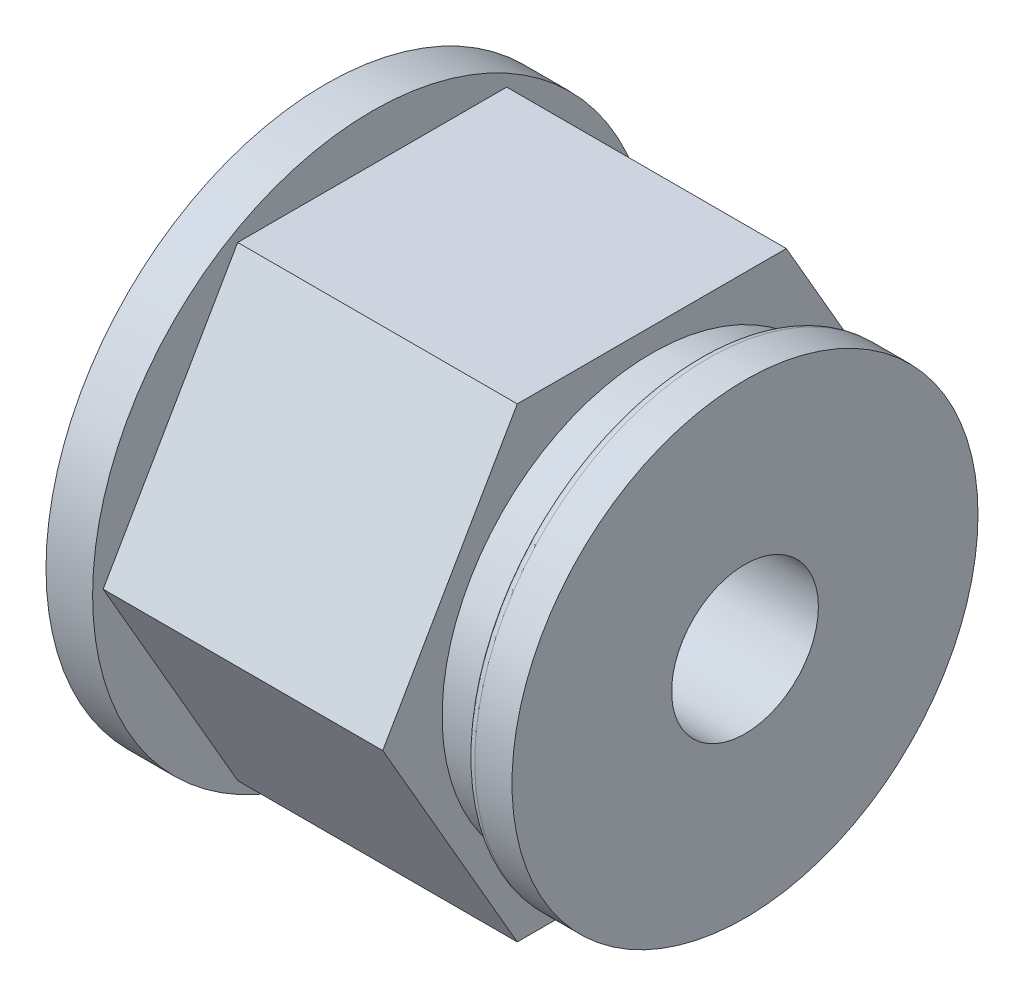
ISO-10303-21;
HEADER;
FILE_DESCRIPTION(('STEP AP214'),'2;1');
FILE_NAME('part.step','',(''),(''),'','','');
FILE_SCHEMA(('AUTOMOTIVE_DESIGN { 1 0 10303 214 1 1 1 1 }'));
ENDSEC;
DATA;
#1=APPLICATION_CONTEXT('core data for automotive mechanical design processes');
#2=APPLICATION_PROTOCOL_DEFINITION('international standard','automotive_design',2000,#1);
#3=PRODUCT_CONTEXT('',#1,'mechanical');
#4=PRODUCT('Part','Part','',(#3));
#5=PRODUCT_RELATED_PRODUCT_CATEGORY('part','',(#4));
#6=PRODUCT_DEFINITION_FORMATION('','',#4);
#7=PRODUCT_DEFINITION_CONTEXT('part definition',#1,'design');
#8=PRODUCT_DEFINITION('design','',#6,#7);
#9=PRODUCT_DEFINITION_SHAPE('','',#8);
#10=(LENGTH_UNIT() NAMED_UNIT(*) SI_UNIT(.MILLI.,.METRE.));
#11=(NAMED_UNIT(*) PLANE_ANGLE_UNIT() SI_UNIT($,.RADIAN.));
#12=(NAMED_UNIT(*) SI_UNIT($,.STERADIAN.) SOLID_ANGLE_UNIT());
#13=UNCERTAINTY_MEASURE_WITH_UNIT(LENGTH_MEASURE(1.E-05),#10,'distance_accuracy_value','');
#14=(GEOMETRIC_REPRESENTATION_CONTEXT(3) GLOBAL_UNCERTAINTY_ASSIGNED_CONTEXT((#13)) GLOBAL_UNIT_ASSIGNED_CONTEXT((#10,
#11,#12)) REPRESENTATION_CONTEXT('',''));
#15=CARTESIAN_POINT('',(0.,0.,0.));
#16=DIRECTION('',(0.,0.,1.));
#17=DIRECTION('',(1.,0.,0.));
#18=AXIS2_PLACEMENT_3D('',#15,#16,#17);
#19=CARTESIAN_POINT('',(-1.27,0.,0.));
#20=DIRECTION('',(1.,0.,0.));
#21=DIRECTION('',(0.,0.,-1.));
#22=AXIS2_PLACEMENT_3D('',#19,#20,#21);
#23=CYLINDRICAL_SURFACE('',#22,7.62);
#24=CARTESIAN_POINT('',(-1.27,0.,0.));
#25=DIRECTION('',(1.,0.,0.));
#26=DIRECTION('',(0.,0.,-1.));
#27=AXIS2_PLACEMENT_3D('',#24,#25,#26);
#28=CIRCLE('',#27,7.62);
#29=CARTESIAN_POINT('',(-1.27,0.,-7.62));
#30=VERTEX_POINT('',#29);
#31=EDGE_CURVE('E111',#30,#30,#28,.T.);
#32=ORIENTED_EDGE('',*,*,#31,.T.);
#33=EDGE_LOOP('',(#32));
#34=FACE_BOUND('',#33,.T.);
#35=CARTESIAN_POINT('',(0.,0.,0.));
#36=DIRECTION('',(1.,0.,0.));
#37=DIRECTION('',(0.,0.,-1.));
#38=AXIS2_PLACEMENT_3D('',#35,#36,#37);
#39=CIRCLE('',#38,7.62);
#40=CARTESIAN_POINT('',(0.,0.,-7.62));
#41=VERTEX_POINT('',#40);
#42=EDGE_CURVE('E108',#41,#41,#39,.T.);
#43=ORIENTED_EDGE('',*,*,#42,.F.);
#44=EDGE_LOOP('',(#43));
#45=FACE_BOUND('',#44,.T.);
#46=ADVANCED_FACE('F35',(#34,#45),#23,.T.);
#47=CARTESIAN_POINT('',(-1.27,0.,0.));
#48=DIRECTION('',(1.,0.,0.));
#49=DIRECTION('',(0.,0.,-1.));
#50=AXIS2_PLACEMENT_3D('',#47,#48,#49);
#51=PLANE('',#50);
#52=CARTESIAN_POINT('',(-1.27,0.,0.));
#53=DIRECTION('',(1.,0.,0.));
#54=DIRECTION('',(0.,0.,-1.));
#55=AXIS2_PLACEMENT_3D('',#52,#53,#54);
#56=CIRCLE('',#55,2.);
#57=CARTESIAN_POINT('',(-1.27,0.,-2.));
#58=VERTEX_POINT('',#57);
#59=EDGE_CURVE('E156',#58,#58,#56,.F.);
#60=ORIENTED_EDGE('',*,*,#59,.F.);
#61=EDGE_LOOP('',(#60));
#62=FACE_BOUND('',#61,.T.);
#63=ORIENTED_EDGE('',*,*,#31,.F.);
#64=EDGE_LOOP('',(#63));
#65=FACE_BOUND('',#64,.T.);
#66=ADVANCED_FACE('F216',(#62,#65),#51,.F.);
#67=CARTESIAN_POINT('',(0.,0.,0.));
#68=DIRECTION('',(1.,0.,0.));
#69=DIRECTION('',(0.,0.,-1.));
#70=AXIS2_PLACEMENT_3D('',#67,#68,#69);
#71=PLANE('',#70);
#72=DIRECTION('',(0.,0.,1.));
#73=VECTOR('',#72,1.);
#74=CARTESIAN_POINT('',(0.,6.35,-3.66617420935412));
#75=LINE('',#74,#73);
#76=CARTESIAN_POINT('',(0.,6.35,-3.66617420935412));
#77=VERTEX_POINT('',#76);
#78=CARTESIAN_POINT('',(0.,6.35,3.66617420935412));
#79=VERTEX_POINT('',#78);
#80=EDGE_CURVE('E50',#77,#79,#75,.T.);
#81=ORIENTED_EDGE('',*,*,#80,.F.);
#82=DIRECTION('',(0.,0.866025403784439,0.5));
#83=VECTOR('',#82,1.);
#84=CARTESIAN_POINT('',(0.,0.,-7.33234841870825));
#85=LINE('',#84,#83);
#86=CARTESIAN_POINT('',(0.,0.,-7.33234841870825));
#87=VERTEX_POINT('',#86);
#88=EDGE_CURVE('E54',#87,#77,#85,.T.);
#89=ORIENTED_EDGE('',*,*,#88,.F.);
#90=DIRECTION('',(0.,0.866025403784438,-0.5));
#91=VECTOR('',#90,1.);
#92=CARTESIAN_POINT('',(0.,-6.35,-3.66617420935412));
#93=LINE('',#92,#91);
#94=CARTESIAN_POINT('',(0.,-6.35,-3.66617420935412));
#95=VERTEX_POINT('',#94);
#96=EDGE_CURVE('E181',#95,#87,#93,.T.);
#97=ORIENTED_EDGE('',*,*,#96,.F.);
#98=DIRECTION('',(0.,0.,-1.));
#99=VECTOR('',#98,1.);
#100=CARTESIAN_POINT('',(0.,-6.35,3.66617420935412));
#101=LINE('',#100,#99);
#102=CARTESIAN_POINT('',(0.,-6.35,3.66617420935412));
#103=VERTEX_POINT('',#102);
#104=EDGE_CURVE('E178',#103,#95,#101,.T.);
#105=ORIENTED_EDGE('',*,*,#104,.F.);
#106=DIRECTION('',(0.,-0.866025403784439,-0.5));
#107=VECTOR('',#106,1.);
#108=CARTESIAN_POINT('',(0.,0.,7.33234841870825));
#109=LINE('',#108,#107);
#110=CARTESIAN_POINT('',(0.,0.,7.33234841870825));
#111=VERTEX_POINT('',#110);
#112=EDGE_CURVE('E175',#111,#103,#109,.T.);
#113=ORIENTED_EDGE('',*,*,#112,.F.);
#114=DIRECTION('',(0.,-0.866025403784438,0.5));
#115=VECTOR('',#114,1.);
#116=CARTESIAN_POINT('',(0.,6.35,3.66617420935412));
#117=LINE('',#116,#115);
#118=EDGE_CURVE('E158',#79,#111,#117,.T.);
#119=ORIENTED_EDGE('',*,*,#118,.F.);
#120=EDGE_LOOP('',(#81,#89,#97,#105,#113,#119));
#121=FACE_BOUND('',#120,.T.);
#122=ORIENTED_EDGE('',*,*,#42,.T.);
#123=EDGE_LOOP('',(#122));
#124=FACE_BOUND('',#123,.T.);
#125=ADVANCED_FACE('F198',(#121,#124),#71,.T.);
#126=CARTESIAN_POINT('',(7.62,6.35,-3.66617420935412));
#127=DIRECTION('',(0.,-1.,0.));
#128=DIRECTION('',(0.,0.,-1.));
#129=AXIS2_PLACEMENT_3D('',#126,#127,#128);
#130=PLANE('',#129);
#131=ORIENTED_EDGE('',*,*,#80,.T.);
#132=DIRECTION('',(-1.,0.,0.));
#133=VECTOR('',#132,1.);
#134=CARTESIAN_POINT('',(7.62,6.35,3.66617420935412));
#135=LINE('',#134,#133);
#136=CARTESIAN_POINT('',(7.62,6.35,3.66617420935412));
#137=VERTEX_POINT('',#136);
#138=EDGE_CURVE('E91',#137,#79,#135,.T.);
#139=ORIENTED_EDGE('',*,*,#138,.F.);
#140=DIRECTION('',(0.,0.,1.));
#141=VECTOR('',#140,1.);
#142=CARTESIAN_POINT('',(7.62,6.35,-3.66617420935412));
#143=LINE('',#142,#141);
#144=CARTESIAN_POINT('',(7.62,6.35,-3.66617420935412));
#145=VERTEX_POINT('',#144);
#146=EDGE_CURVE('E97',#145,#137,#143,.T.);
#147=ORIENTED_EDGE('',*,*,#146,.F.);
#148=DIRECTION('',(-1.,0.,0.));
#149=VECTOR('',#148,1.);
#150=CARTESIAN_POINT('',(7.62,6.35,-3.66617420935412));
#151=LINE('',#150,#149);
#152=EDGE_CURVE('E172',#145,#77,#151,.T.);
#153=ORIENTED_EDGE('',*,*,#152,.T.);
#154=EDGE_LOOP('',(#131,#139,#147,#153));
#155=FACE_BOUND('',#154,.T.);
#156=ADVANCED_FACE('F107',(#155),#130,.F.);
#157=CARTESIAN_POINT('',(7.62,6.35,3.66617420935412));
#158=DIRECTION('',(0.,-0.5,-0.866025403784439));
#159=DIRECTION('',(0.,0.866025403784439,-0.5));
#160=AXIS2_PLACEMENT_3D('',#157,#158,#159);
#161=PLANE('',#160);
#162=ORIENTED_EDGE('',*,*,#118,.T.);
#163=DIRECTION('',(-1.,0.,0.));
#164=VECTOR('',#163,1.);
#165=CARTESIAN_POINT('',(7.62,0.,7.33234841870825));
#166=LINE('',#165,#164);
#167=CARTESIAN_POINT('',(7.62,0.,7.33234841870825));
#168=VERTEX_POINT('',#167);
#169=EDGE_CURVE('E93',#168,#111,#166,.T.);
#170=ORIENTED_EDGE('',*,*,#169,.F.);
#171=DIRECTION('',(0.,-0.866025403784438,0.5));
#172=VECTOR('',#171,1.);
#173=CARTESIAN_POINT('',(7.62,6.35,3.66617420935412));
#174=LINE('',#173,#172);
#175=EDGE_CURVE('E86',#137,#168,#174,.T.);
#176=ORIENTED_EDGE('',*,*,#175,.F.);
#177=ORIENTED_EDGE('',*,*,#138,.T.);
#178=EDGE_LOOP('',(#162,#170,#176,#177));
#179=FACE_BOUND('',#178,.T.);
#180=ADVANCED_FACE('F89',(#179),#161,.F.);
#181=CARTESIAN_POINT('',(7.62,0.,7.33234841870825));
#182=DIRECTION('',(0.,0.5,-0.866025403784439));
#183=DIRECTION('',(0.,0.866025403784439,0.5));
#184=AXIS2_PLACEMENT_3D('',#181,#182,#183);
#185=PLANE('',#184);
#186=ORIENTED_EDGE('',*,*,#112,.T.);
#187=DIRECTION('',(-1.,0.,0.));
#188=VECTOR('',#187,1.);
#189=CARTESIAN_POINT('',(7.62,-6.35,3.66617420935412));
#190=LINE('',#189,#188);
#191=CARTESIAN_POINT('',(7.62,-6.35,3.66617420935412));
#192=VERTEX_POINT('',#191);
#193=EDGE_CURVE('E113',#192,#103,#190,.T.);
#194=ORIENTED_EDGE('',*,*,#193,.F.);
#195=DIRECTION('',(0.,-0.866025403784439,-0.5));
#196=VECTOR('',#195,1.);
#197=CARTESIAN_POINT('',(7.62,0.,7.33234841870825));
#198=LINE('',#197,#196);
#199=EDGE_CURVE('E96',#168,#192,#198,.T.);
#200=ORIENTED_EDGE('',*,*,#199,.F.);
#201=ORIENTED_EDGE('',*,*,#169,.T.);
#202=EDGE_LOOP('',(#186,#194,#200,#201));
#203=FACE_BOUND('',#202,.T.);
#204=ADVANCED_FACE('F197',(#203),#185,.F.);
#205=CARTESIAN_POINT('',(7.62,-6.35,3.66617420935412));
#206=DIRECTION('',(0.,1.,0.));
#207=DIRECTION('',(0.,0.,1.));
#208=AXIS2_PLACEMENT_3D('',#205,#206,#207);
#209=PLANE('',#208);
#210=ORIENTED_EDGE('',*,*,#104,.T.);
#211=DIRECTION('',(-1.,0.,0.));
#212=VECTOR('',#211,1.);
#213=CARTESIAN_POINT('',(7.62,-6.35,-3.66617420935412));
#214=LINE('',#213,#212);
#215=CARTESIAN_POINT('',(7.62,-6.35,-3.66617420935412));
#216=VERTEX_POINT('',#215);
#217=EDGE_CURVE('E188',#216,#95,#214,.T.);
#218=ORIENTED_EDGE('',*,*,#217,.F.);
#219=DIRECTION('',(0.,0.,-1.));
#220=VECTOR('',#219,1.);
#221=CARTESIAN_POINT('',(7.62,-6.35,3.66617420935412));
#222=LINE('',#221,#220);
#223=EDGE_CURVE('E168',#192,#216,#222,.T.);
#224=ORIENTED_EDGE('',*,*,#223,.F.);
#225=ORIENTED_EDGE('',*,*,#193,.T.);
#226=EDGE_LOOP('',(#210,#218,#224,#225));
#227=FACE_BOUND('',#226,.T.);
#228=ADVANCED_FACE('F194',(#227),#209,.F.);
#229=CARTESIAN_POINT('',(7.62,-6.35,-3.66617420935412));
#230=DIRECTION('',(0.,0.5,0.866025403784438));
#231=DIRECTION('',(0.,-0.866025403784438,0.5));
#232=AXIS2_PLACEMENT_3D('',#229,#230,#231);
#233=PLANE('',#232);
#234=ORIENTED_EDGE('',*,*,#96,.T.);
#235=DIRECTION('',(-1.,0.,0.));
#236=VECTOR('',#235,1.);
#237=CARTESIAN_POINT('',(7.62,0.,-7.33234841870825));
#238=LINE('',#237,#236);
#239=CARTESIAN_POINT('',(7.62,0.,-7.33234841870825));
#240=VERTEX_POINT('',#239);
#241=EDGE_CURVE('E185',#240,#87,#238,.T.);
#242=ORIENTED_EDGE('',*,*,#241,.F.);
#243=DIRECTION('',(0.,0.866025403784438,-0.5));
#244=VECTOR('',#243,1.);
#245=CARTESIAN_POINT('',(7.62,-6.35,-3.66617420935412));
#246=LINE('',#245,#244);
#247=EDGE_CURVE('E170',#216,#240,#246,.T.);
#248=ORIENTED_EDGE('',*,*,#247,.F.);
#249=ORIENTED_EDGE('',*,*,#217,.T.);
#250=EDGE_LOOP('',(#234,#242,#248,#249));
#251=FACE_BOUND('',#250,.T.);
#252=ADVANCED_FACE('F202',(#251),#233,.F.);
#253=CARTESIAN_POINT('',(7.62,0.,-7.33234841870825));
#254=DIRECTION('',(0.,-0.5,0.866025403784439));
#255=DIRECTION('',(0.,-0.866025403784439,-0.5));
#256=AXIS2_PLACEMENT_3D('',#253,#254,#255);
#257=PLANE('',#256);
#258=ORIENTED_EDGE('',*,*,#88,.T.);
#259=ORIENTED_EDGE('',*,*,#152,.F.);
#260=DIRECTION('',(0.,0.866025403784439,0.5));
#261=VECTOR('',#260,1.);
#262=CARTESIAN_POINT('',(7.62,0.,-7.33234841870825));
#263=LINE('',#262,#261);
#264=EDGE_CURVE('E102',#240,#145,#263,.T.);
#265=ORIENTED_EDGE('',*,*,#264,.F.);
#266=ORIENTED_EDGE('',*,*,#241,.T.);
#267=EDGE_LOOP('',(#258,#259,#265,#266));
#268=FACE_BOUND('',#267,.T.);
#269=ADVANCED_FACE('F205',(#268),#257,.F.);
#270=CARTESIAN_POINT('',(7.62,0.,0.));
#271=DIRECTION('',(1.,0.,0.));
#272=DIRECTION('',(0.,0.,-1.));
#273=AXIS2_PLACEMENT_3D('',#270,#271,#272);
#274=PLANE('',#273);
#275=CARTESIAN_POINT('',(7.62,0.,0.));
#276=DIRECTION('',(1.,0.,0.));
#277=DIRECTION('',(0.,0.,-1.));
#278=AXIS2_PLACEMENT_3D('',#275,#276,#277);
#279=CIRCLE('',#278,5.715);
#280=CARTESIAN_POINT('',(7.62,0.,-5.715));
#281=VERTEX_POINT('',#280);
#282=EDGE_CURVE('E118',#281,#281,#279,.T.);
#283=ORIENTED_EDGE('',*,*,#282,.F.);
#284=EDGE_LOOP('',(#283));
#285=FACE_BOUND('',#284,.T.);
#286=ORIENTED_EDGE('',*,*,#146,.T.);
#287=ORIENTED_EDGE('',*,*,#175,.T.);
#288=ORIENTED_EDGE('',*,*,#199,.T.);
#289=ORIENTED_EDGE('',*,*,#223,.T.);
#290=ORIENTED_EDGE('',*,*,#247,.T.);
#291=ORIENTED_EDGE('',*,*,#264,.T.);
#292=EDGE_LOOP('',(#286,#287,#288,#289,#290,#291));
#293=FACE_BOUND('',#292,.T.);
#294=ADVANCED_FACE('F100',(#285,#293),#274,.T.);
#295=CARTESIAN_POINT('',(8.89,0.,0.));
#296=DIRECTION('',(-1.,0.,0.));
#297=DIRECTION('',(0.,0.,1.));
#298=AXIS2_PLACEMENT_3D('',#295,#296,#297);
#299=CYLINDRICAL_SURFACE('',#298,5.715);
#300=CARTESIAN_POINT('',(8.636,0.,0.));
#301=DIRECTION('',(1.,0.,0.));
#302=DIRECTION('',(0.,0.,-1.));
#303=AXIS2_PLACEMENT_3D('',#300,#301,#302);
#304=CIRCLE('',#303,5.715);
#305=CARTESIAN_POINT('',(8.636,0.,-5.715));
#306=VERTEX_POINT('',#305);
#307=EDGE_CURVE('E43',#306,#306,#304,.F.);
#308=ORIENTED_EDGE('',*,*,#307,.T.);
#309=EDGE_LOOP('',(#308));
#310=FACE_BOUND('',#309,.T.);
#311=ORIENTED_EDGE('',*,*,#282,.T.);
#312=EDGE_LOOP('',(#311));
#313=FACE_BOUND('',#312,.T.);
#314=ADVANCED_FACE('F128',(#310,#313),#299,.T.);
#315=CARTESIAN_POINT('',(10.16,0.,0.));
#316=DIRECTION('',(-1.,0.,0.));
#317=DIRECTION('',(0.,0.,1.));
#318=AXIS2_PLACEMENT_3D('',#315,#316,#317);
#319=CYLINDRICAL_SURFACE('',#318,6.35);
#320=CARTESIAN_POINT('',(9.144,0.,0.));
#321=DIRECTION('',(1.,0.,0.));
#322=DIRECTION('',(0.,0.,-1.));
#323=AXIS2_PLACEMENT_3D('',#320,#321,#322);
#324=CIRCLE('',#323,6.35);
#325=CARTESIAN_POINT('',(9.144,0.,-6.35));
#326=VERTEX_POINT('',#325);
#327=EDGE_CURVE('E11',#326,#326,#324,.T.);
#328=ORIENTED_EDGE('',*,*,#327,.T.);
#329=EDGE_LOOP('',(#328));
#330=FACE_BOUND('',#329,.T.);
#331=CARTESIAN_POINT('',(10.16,0.,0.));
#332=DIRECTION('',(1.,0.,0.));
#333=DIRECTION('',(0.,0.,-1.));
#334=AXIS2_PLACEMENT_3D('',#331,#332,#333);
#335=CIRCLE('',#334,6.35);
#336=CARTESIAN_POINT('',(10.16,0.,-6.35));
#337=VERTEX_POINT('',#336);
#338=EDGE_CURVE('E154',#337,#337,#335,.T.);
#339=ORIENTED_EDGE('',*,*,#338,.F.);
#340=EDGE_LOOP('',(#339));
#341=FACE_BOUND('',#340,.T.);
#342=ADVANCED_FACE('F148',(#330,#341),#319,.T.);
#343=CARTESIAN_POINT('',(10.16,0.,0.));
#344=DIRECTION('',(1.,0.,0.));
#345=DIRECTION('',(0.,0.,-1.));
#346=AXIS2_PLACEMENT_3D('',#343,#344,#345);
#347=PLANE('',#346);
#348=CARTESIAN_POINT('',(10.16,0.,0.));
#349=DIRECTION('',(1.,0.,0.));
#350=DIRECTION('',(0.,0.,-1.));
#351=AXIS2_PLACEMENT_3D('',#348,#349,#350);
#352=CIRCLE('',#351,2.);
#353=CARTESIAN_POINT('',(10.16,0.,-2.));
#354=VERTEX_POINT('',#353);
#355=EDGE_CURVE('E161',#354,#354,#352,.T.);
#356=ORIENTED_EDGE('',*,*,#355,.F.);
#357=EDGE_LOOP('',(#356));
#358=FACE_BOUND('',#357,.T.);
#359=ORIENTED_EDGE('',*,*,#338,.T.);
#360=EDGE_LOOP('',(#359));
#361=FACE_BOUND('',#360,.T.);
#362=ADVANCED_FACE('F139',(#358,#361),#347,.T.);
#363=CARTESIAN_POINT('',(8.89,0.,0.));
#364=DIRECTION('',(1.,0.,0.));
#365=DIRECTION('',(0.,0.,-1.));
#366=AXIS2_PLACEMENT_3D('',#363,#364,#365);
#367=PLANE('',#366);
#368=CARTESIAN_POINT('',(8.89,0.,0.));
#369=DIRECTION('',(1.,0.,0.));
#370=DIRECTION('',(0.,0.,-1.));
#371=AXIS2_PLACEMENT_3D('',#368,#369,#370);
#372=CIRCLE('',#371,5.969);
#373=CARTESIAN_POINT('',(8.89,0.,-5.969));
#374=VERTEX_POINT('',#373);
#375=EDGE_CURVE('E123',#374,#374,#372,.T.);
#376=ORIENTED_EDGE('',*,*,#375,.T.);
#377=EDGE_LOOP('',(#376));
#378=FACE_BOUND('',#377,.T.);
#379=CARTESIAN_POINT('',(8.89,0.,0.));
#380=DIRECTION('',(1.,0.,0.));
#381=DIRECTION('',(0.,0.,-1.));
#382=AXIS2_PLACEMENT_3D('',#379,#380,#381);
#383=CIRCLE('',#382,6.096);
#384=CARTESIAN_POINT('',(8.89,0.,-6.096));
#385=VERTEX_POINT('',#384);
#386=EDGE_CURVE('E120',#385,#385,#383,.F.);
#387=ORIENTED_EDGE('',*,*,#386,.T.);
#388=EDGE_LOOP('',(#387));
#389=FACE_BOUND('',#388,.T.);
#390=ADVANCED_FACE('F134',(#378,#389),#367,.F.);
#391=CARTESIAN_POINT('',(8.636,0.,0.));
#392=DIRECTION('',(1.,0.,0.));
#393=DIRECTION('',(0.,0.,-1.));
#394=AXIS2_PLACEMENT_3D('',#391,#392,#393);
#395=TOROIDAL_SURFACE('',#394,5.969,0.254);
#396=ORIENTED_EDGE('',*,*,#307,.F.);
#397=EDGE_LOOP('',(#396));
#398=FACE_BOUND('',#397,.T.);
#399=ORIENTED_EDGE('',*,*,#375,.F.);
#400=EDGE_LOOP('',(#399));
#401=FACE_BOUND('',#400,.T.);
#402=ADVANCED_FACE('F131',(#398,#401),#395,.F.);
#403=CARTESIAN_POINT('',(9.144,0.,0.));
#404=DIRECTION('',(1.,0.,0.));
#405=DIRECTION('',(0.,0.,-1.));
#406=AXIS2_PLACEMENT_3D('',#403,#404,#405);
#407=TOROIDAL_SURFACE('',#406,6.096,0.254);
#408=ORIENTED_EDGE('',*,*,#386,.F.);
#409=EDGE_LOOP('',(#408));
#410=FACE_BOUND('',#409,.T.);
#411=ORIENTED_EDGE('',*,*,#327,.F.);
#412=EDGE_LOOP('',(#411));
#413=FACE_BOUND('',#412,.T.);
#414=ADVANCED_FACE('F37',(#410,#413),#407,.T.);
#415=CARTESIAN_POINT('',(-6.92685424949238,0.,0.));
#416=DIRECTION('',(1.,0.,0.));
#417=DIRECTION('',(0.,0.,-1.));
#418=AXIS2_PLACEMENT_3D('',#415,#416,#417);
#419=CYLINDRICAL_SURFACE('',#418,2.);
#420=ORIENTED_EDGE('',*,*,#59,.T.);
#421=EDGE_LOOP('',(#420));
#422=FACE_BOUND('',#421,.T.);
#423=ORIENTED_EDGE('',*,*,#355,.T.);
#424=EDGE_LOOP('',(#423));
#425=FACE_BOUND('',#424,.T.);
#426=ADVANCED_FACE('F145',(#422,#425),#419,.F.);
#427=CLOSED_SHELL('',(#46,#66,#125,#156,#180,#204,#228,#252,#269,#294,#314,#342,#362,#390,#402,
#414,#426));
#428=MANIFOLD_SOLID_BREP('B2',#427);
#429=ADVANCED_BREP_SHAPE_REPRESENTATION('',(#18,#428),#14);
#430=SHAPE_DEFINITION_REPRESENTATION(#9,#429);
ENDSEC;
END-ISO-10303-21;
